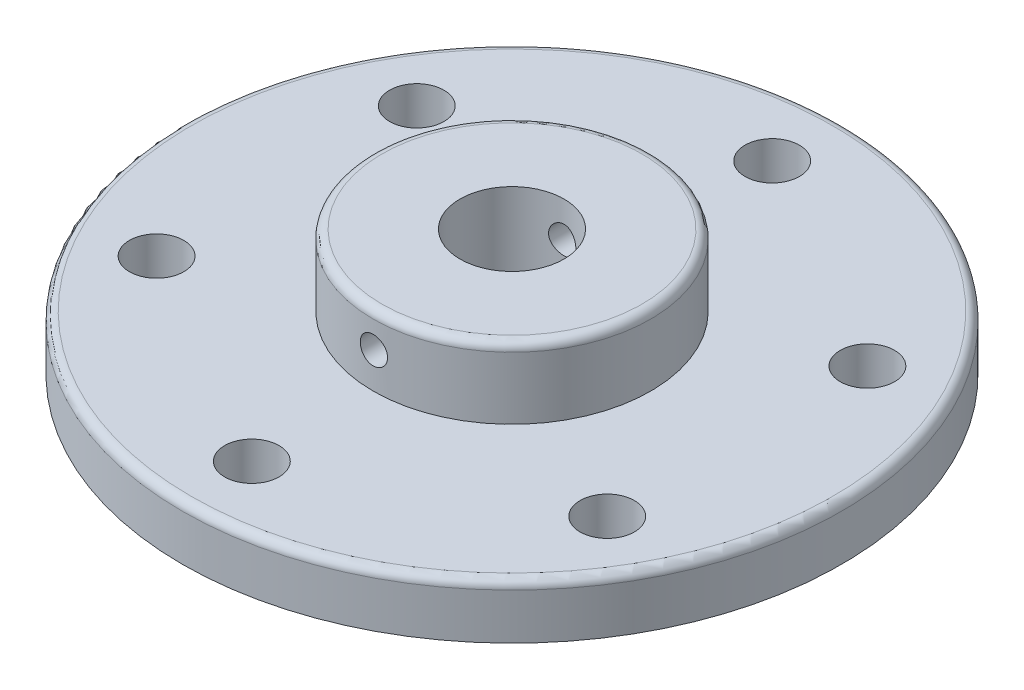
ISO-10303-21;
HEADER;
FILE_DESCRIPTION(('STEP AP214'),'2;1');
FILE_NAME('part.step','',(''),(''),'','','');
FILE_SCHEMA(('AUTOMOTIVE_DESIGN { 1 0 10303 214 1 1 1 1 }'));
ENDSEC;
DATA;
#1=APPLICATION_CONTEXT('core data for automotive mechanical design processes');
#2=APPLICATION_PROTOCOL_DEFINITION('international standard','automotive_design',2000,#1);
#3=PRODUCT_CONTEXT('',#1,'mechanical');
#4=PRODUCT('Part','Part','',(#3));
#5=PRODUCT_RELATED_PRODUCT_CATEGORY('part','',(#4));
#6=PRODUCT_DEFINITION_FORMATION('','',#4);
#7=PRODUCT_DEFINITION_CONTEXT('part definition',#1,'design');
#8=PRODUCT_DEFINITION('design','',#6,#7);
#9=PRODUCT_DEFINITION_SHAPE('','',#8);
#10=(LENGTH_UNIT() NAMED_UNIT(*) SI_UNIT(.MILLI.,.METRE.));
#11=(NAMED_UNIT(*) PLANE_ANGLE_UNIT() SI_UNIT($,.RADIAN.));
#12=(NAMED_UNIT(*) SI_UNIT($,.STERADIAN.) SOLID_ANGLE_UNIT());
#13=UNCERTAINTY_MEASURE_WITH_UNIT(LENGTH_MEASURE(1.E-05),#10,'distance_accuracy_value','');
#14=(GEOMETRIC_REPRESENTATION_CONTEXT(3) GLOBAL_UNCERTAINTY_ASSIGNED_CONTEXT((#13)) GLOBAL_UNIT_ASSIGNED_CONTEXT((#10,
#11,#12)) REPRESENTATION_CONTEXT('',''));
#15=CARTESIAN_POINT('',(0.,0.,0.));
#16=DIRECTION('',(0.,0.,1.));
#17=DIRECTION('',(1.,0.,0.));
#18=AXIS2_PLACEMENT_3D('',#15,#16,#17);
#19=CARTESIAN_POINT('',(0.,-5.,0.));
#20=DIRECTION('',(0.,1.,0.));
#21=DIRECTION('',(0.,0.,1.));
#22=AXIS2_PLACEMENT_3D('',#19,#20,#21);
#23=CYLINDRICAL_SURFACE('',#22,30.1625);
#24=CARTESIAN_POINT('',(0.,-0.79375,0.));
#25=DIRECTION('',(0.,1.,0.));
#26=DIRECTION('',(0.,0.,1.));
#27=AXIS2_PLACEMENT_3D('',#24,#25,#26);
#28=CIRCLE('',#27,30.1625);
#29=CARTESIAN_POINT('',(0.,-0.79375,30.1625));
#30=VERTEX_POINT('',#29);
#31=EDGE_CURVE('E10',#30,#30,#28,.F.);
#32=ORIENTED_EDGE('',*,*,#31,.T.);
#33=EDGE_LOOP('',(#32));
#34=FACE_BOUND('',#33,.T.);
#35=CARTESIAN_POINT('',(0.,-5.,0.));
#36=DIRECTION('',(0.,1.,0.));
#37=DIRECTION('',(0.,0.,1.));
#38=AXIS2_PLACEMENT_3D('',#35,#36,#37);
#39=CIRCLE('',#38,30.1625);
#40=CARTESIAN_POINT('',(0.,-5.,30.1625));
#41=VERTEX_POINT('',#40);
#42=EDGE_CURVE('E136',#41,#41,#39,.T.);
#43=ORIENTED_EDGE('',*,*,#42,.T.);
#44=EDGE_LOOP('',(#43));
#45=FACE_BOUND('',#44,.T.);
#46=ADVANCED_FACE('F38',(#34,#45),#23,.T.);
#47=CARTESIAN_POINT('',(0.,-5.,0.));
#48=DIRECTION('',(0.,1.,0.));
#49=DIRECTION('',(0.,0.,1.));
#50=AXIS2_PLACEMENT_3D('',#47,#48,#49);
#51=CYLINDRICAL_SURFACE('',#50,4.7625);
#52=CARTESIAN_POINT('',(0.,2.,4.7625));
#53=CARTESIAN_POINT('',(0.0689488269895443,2.00000171735201,4.76249892350248));
#54=CARTESIAN_POINT('',(0.137916249732853,2.00572387211581,4.76098791352569));
#55=CARTESIAN_POINT('',(0.273866948453047,2.02842240107246,4.75510685303733));
#56=CARTESIAN_POINT('',(0.340849208276611,2.04540443840435,4.75073536386706));
#57=CARTESIAN_POINT('',(0.470847324819608,2.09003455682169,4.73961624911541));
#58=CARTESIAN_POINT('',(0.533868088670452,2.1176691271607,4.73287163434153));
#59=CARTESIAN_POINT('',(0.654380149036169,2.18277043361157,4.71772047020067));
#60=CARTESIAN_POINT('',(0.711871122906726,2.22023774295513,4.70931382394719));
#61=CARTESIAN_POINT('',(0.820986470277109,2.30483200429416,4.69153581720155));
#62=CARTESIAN_POINT('',(0.872468553444093,2.35213911742376,4.68214837483676));
#63=CARTESIAN_POINT('',(0.96686688478941,2.45468482974981,4.66357097403559));
#64=CARTESIAN_POINT('',(1.00978206633533,2.509924415118,4.65438104031722));
#65=CARTESIAN_POINT('',(1.08651582428672,2.6278948176093,4.63707529018651));
#66=CARTESIAN_POINT('',(1.12017187342694,2.69073460486448,4.6289797969026));
#67=CARTESIAN_POINT('',(1.17638558308836,2.82142742777947,4.61501548950117));
#68=CARTESIAN_POINT('',(1.1989452192048,2.88927956856841,4.60914627906091));
#69=CARTESIAN_POINT('',(1.23183379886142,3.02649802227186,4.60046491688714));
#70=CARTESIAN_POINT('',(1.24242017860249,3.09579847100102,4.59758852991801));
#71=CARTESIAN_POINT('',(1.25186415000504,3.23524683470881,4.59502647971797));
#72=CARTESIAN_POINT('',(1.25072385935279,3.30539459438866,4.59534024038719));
#73=CARTESIAN_POINT('',(1.23695149883691,3.44254642657536,4.59906547949983));
#74=CARTESIAN_POINT('',(1.22462970188497,3.50958428719493,4.60239331631598));
#75=CARTESIAN_POINT('',(1.1893405287158,3.64060624329908,4.61163798030708));
#76=CARTESIAN_POINT('',(1.16637232540632,3.7045901010999,4.61755500862773));
#77=CARTESIAN_POINT('',(1.11018652844068,3.82850251570776,4.63138572997379));
#78=CARTESIAN_POINT('',(1.07685917787071,3.88837883830269,4.63932063065522));
#79=CARTESIAN_POINT('',(1.00097774509561,4.00179874829137,4.65628148655067));
#80=CARTESIAN_POINT('',(0.958421898098481,4.05534112139473,4.66530765030377));
#81=CARTESIAN_POINT('',(0.863699684388387,4.15634737338864,4.68378320724794));
#82=CARTESIAN_POINT('',(0.811272432129532,4.20356613335335,4.69323696794645));
#83=CARTESIAN_POINT('',(0.69912855558021,4.28859070192067,4.71124674232189));
#84=CARTESIAN_POINT('',(0.639411661618622,4.32639616213275,4.71980272276477));
#85=CARTESIAN_POINT('',(0.514011757722163,4.39162423624815,4.73510285261534));
#86=CARTESIAN_POINT('',(0.448305300721089,4.41900366482509,4.741839433184));
#87=CARTESIAN_POINT('',(0.31300524095278,4.46225782022922,4.75268695115514));
#88=CARTESIAN_POINT('',(0.243412463556183,4.47813497995712,4.75679844378086));
#89=CARTESIAN_POINT('',(0.104408120703845,4.49755175001476,4.76184902928973));
#90=CARTESIAN_POINT('',(0.0350461696468035,4.50142475686744,4.76287382691041));
#91=CARTESIAN_POINT('',(-0.103335803501143,4.49764237430326,4.76188136816725));
#92=CARTESIAN_POINT('',(-0.172355859057596,4.48998813650211,4.75986441568581));
#93=CARTESIAN_POINT('',(-0.306912963279038,4.46364236805612,4.7530703319408));
#94=CARTESIAN_POINT('',(-0.37248876628675,4.44513574579216,4.74833947030658));
#95=CARTESIAN_POINT('',(-0.499599496842098,4.39782436091347,4.73665325835686));
#96=CARTESIAN_POINT('',(-0.561133992851572,4.36901850063674,4.72969767094507));
#97=CARTESIAN_POINT('',(-0.679718836805753,4.30130081725949,4.71413156698966));
#98=CARTESIAN_POINT('',(-0.73666090763665,4.2622062398836,4.70549194189251));
#99=CARTESIAN_POINT('',(-0.843293871093428,4.17525160425879,4.68755697205323));
#100=CARTESIAN_POINT('',(-0.89298337464544,4.127389870797,4.67826150220249));
#101=CARTESIAN_POINT('',(-0.985097687855372,4.02270557314037,4.65974890421523));
#102=CARTESIAN_POINT('',(-1.02728759830267,3.96567434196143,4.65054081563012));
#103=CARTESIAN_POINT('',(-1.10150190977155,3.84514800694654,4.63352511650848));
#104=CARTESIAN_POINT('',(-1.13352674443343,3.78165317899911,4.62571744623653));
#105=CARTESIAN_POINT('',(-1.18626077762451,3.65032645845984,4.61247560327066));
#106=CARTESIAN_POINT('',(-1.20703611666268,3.58252259423882,4.6070275958912));
#107=CARTESIAN_POINT('',(-1.23684299798427,3.44421726027496,4.59911599923542));
#108=CARTESIAN_POINT('',(-1.24587742774386,3.37371645819029,4.59665167618307));
#109=CARTESIAN_POINT('',(-1.25178379299123,3.23441956279485,4.59504639964924));
#110=CARTESIAN_POINT('',(-1.24903271196827,3.16564039782814,4.59580243207657));
#111=CARTESIAN_POINT('',(-1.23231761019831,3.02956363976079,4.60031226908765));
#112=CARTESIAN_POINT('',(-1.21835386109659,2.96226601080809,4.60406600104719));
#113=CARTESIAN_POINT('',(-1.17982517655743,2.83152047600659,4.61408795675081));
#114=CARTESIAN_POINT('',(-1.15533776233217,2.76804821598219,4.62033777009164));
#115=CARTESIAN_POINT('',(-1.09651728065576,2.6460655717931,4.63464866254929));
#116=CARTESIAN_POINT('',(-1.06218271349251,2.58755594519288,4.64271001752169));
#117=CARTESIAN_POINT('',(-0.983489925232753,2.47535422691613,4.66002342411812));
#118=CARTESIAN_POINT('',(-0.938873327565306,2.42184755691273,4.66930291627762));
#119=CARTESIAN_POINT('',(-0.841377495724145,2.32295814995551,4.68785113845597));
#120=CARTESIAN_POINT('',(-0.78849626845352,2.27757737832148,4.69711986533406));
#121=CARTESIAN_POINT('',(-0.674662319319914,2.19531409863569,4.71482962144214));
#122=CARTESIAN_POINT('',(-0.613566194670514,2.15862515796498,4.72324975484127));
#123=CARTESIAN_POINT('',(-0.485855224781156,2.09609700837243,4.73808723116027));
#124=CARTESIAN_POINT('',(-0.41924406347045,2.07025062575191,4.74450589757513));
#125=CARTESIAN_POINT('',(-0.294038318804134,2.0336332201612,4.75375633848032));
#126=CARTESIAN_POINT('',(-0.235998618132914,2.02104952393142,4.75701167518968));
#127=CARTESIAN_POINT('',(-0.118643789063094,2.00423256019399,4.7613838704496));
#128=CARTESIAN_POINT('',(-0.059328778848326,1.99999852226061,4.76250092629978));
#129=CARTESIAN_POINT('',(0.,2.,4.7625));
#130=B_SPLINE_CURVE_WITH_KNOTS('',3,(#52,#53,#54,#55,#56,#57,#58,#59,#60,#61,#62,#63,#64,#65,
#66,#67,#68,#69,#70,#71,#72,#73,#74,#75,#76,#77,#78,#79,#80,#81,#82,#83,#84,#85,#86,#87,#88,#89,
#90,#91,#92,#93,#94,#95,#96,#97,#98,#99,#100,#101,#102,#103,#104,#105,#106,#107,#108,#109,#110,
#111,#112,#113,#114,#115,#116,#117,#118,#119,#120,#121,#122,#123,#124,#125,#126,#127,#128,#129),
.UNSPECIFIED.,.T.,.F.,(4,2,2,2,2,2,2,2,2,2,2,2,2,2,2,2,2,2,2,2,2,2,2,2,2,2,2,2,2,2,2,2,2,2,2,2,
2,2,4),(0.,0.206628947540086,0.413361897673242,0.619833503863802,0.82631714966735,
1.03697999238148,1.24766904759022,1.46184949115505,1.6759917884144,1.88543667630244,
2.09484374179415,2.29861197653731,2.50239604417056,2.70841740289268,2.91447819447152,
3.12704121112376,3.33961209366173,3.55305412213804,3.76645099126344,3.97386542536042,
4.18125913933899,4.38521782999526,4.58919826444181,4.79708014026652,5.00500177931068,
5.21859009069134,5.43216928920839,5.6444787416811,5.85673597038204,6.06225528548328,
6.26776962169216,6.47179533639976,6.67585214054694,6.88573951059617,7.0956775753812,
7.30992507905382,7.52403060697187,7.70184616919218,7.87964532354366),.UNSPECIFIED.);
#131=CARTESIAN_POINT('',(0.,2.,4.7625));
#132=VERTEX_POINT('',#131);
#133=EDGE_CURVE('E102',#132,#132,#130,.T.);
#134=ORIENTED_EDGE('',*,*,#133,.T.);
#135=EDGE_LOOP('',(#134));
#136=FACE_BOUND('',#135,.T.);
#137=CARTESIAN_POINT('',(0.,2.,-4.7625));
#138=CARTESIAN_POINT('',(-0.0689488269895444,2.00000171735201,-4.76249892350248));
#139=CARTESIAN_POINT('',(-0.137916249732853,2.00572387211582,-4.76098791352569));
#140=CARTESIAN_POINT('',(-0.273866948453047,2.02842240107246,-4.75510685303733));
#141=CARTESIAN_POINT('',(-0.340849208276612,2.04540443840435,-4.75073536386706));
#142=CARTESIAN_POINT('',(-0.470847324819608,2.09003455682169,-4.73961624911541));
#143=CARTESIAN_POINT('',(-0.533868088670452,2.1176691271607,-4.73287163434153));
#144=CARTESIAN_POINT('',(-0.654380149036169,2.18277043361157,-4.71772047020067));
#145=CARTESIAN_POINT('',(-0.711871122906726,2.22023774295513,-4.70931382394719));
#146=CARTESIAN_POINT('',(-0.820986470277109,2.30483200429416,-4.69153581720155));
#147=CARTESIAN_POINT('',(-0.872468553444092,2.35213911742376,-4.68214837483676));
#148=CARTESIAN_POINT('',(-0.96686688478941,2.45468482974981,-4.66357097403559));
#149=CARTESIAN_POINT('',(-1.00978206633533,2.509924415118,-4.65438104031722));
#150=CARTESIAN_POINT('',(-1.08651582428672,2.6278948176093,-4.63707529018651));
#151=CARTESIAN_POINT('',(-1.12017187342694,2.69073460486448,-4.6289797969026));
#152=CARTESIAN_POINT('',(-1.17638558308836,2.82142742777947,-4.61501548950117));
#153=CARTESIAN_POINT('',(-1.1989452192048,2.88927956856841,-4.60914627906091));
#154=CARTESIAN_POINT('',(-1.23183379886142,3.02649802227186,-4.60046491688714));
#155=CARTESIAN_POINT('',(-1.24242017860249,3.09579847100102,-4.59758852991801));
#156=CARTESIAN_POINT('',(-1.25186415000504,3.23524683470881,-4.59502647971797));
#157=CARTESIAN_POINT('',(-1.25072385935279,3.30539459438866,-4.59534024038719));
#158=CARTESIAN_POINT('',(-1.23695149883691,3.44254642657536,-4.59906547949983));
#159=CARTESIAN_POINT('',(-1.22462970188497,3.50958428719493,-4.60239331631598));
#160=CARTESIAN_POINT('',(-1.1893405287158,3.64060624329908,-4.61163798030708));
#161=CARTESIAN_POINT('',(-1.16637232540632,3.7045901010999,-4.61755500862773));
#162=CARTESIAN_POINT('',(-1.11018652844068,3.82850251570776,-4.63138572997379));
#163=CARTESIAN_POINT('',(-1.07685917787071,3.88837883830269,-4.63932063065522));
#164=CARTESIAN_POINT('',(-1.00097774509561,4.00179874829137,-4.65628148655067));
#165=CARTESIAN_POINT('',(-0.95842189809848,4.05534112139473,-4.66530765030377));
#166=CARTESIAN_POINT('',(-0.863699684388387,4.15634737338864,-4.68378320724794));
#167=CARTESIAN_POINT('',(-0.811272432129532,4.20356613335335,-4.69323696794645));
#168=CARTESIAN_POINT('',(-0.699128555580209,4.28859070192068,-4.71124674232189));
#169=CARTESIAN_POINT('',(-0.639411661618621,4.32639616213276,-4.71980272276477));
#170=CARTESIAN_POINT('',(-0.514011757722162,4.39162423624815,-4.73510285261534));
#171=CARTESIAN_POINT('',(-0.448305300721088,4.41900366482509,-4.741839433184));
#172=CARTESIAN_POINT('',(-0.31300524095278,4.46225782022922,-4.75268695115514));
#173=CARTESIAN_POINT('',(-0.243412463556183,4.47813497995712,-4.75679844378086));
#174=CARTESIAN_POINT('',(-0.104408120703845,4.49755175001476,-4.76184902928973));
#175=CARTESIAN_POINT('',(-0.0350461696468035,4.50142475686745,-4.76287382691041));
#176=CARTESIAN_POINT('',(0.103335803501143,4.49764237430327,-4.76188136816725));
#177=CARTESIAN_POINT('',(0.172355859057596,4.48998813650211,-4.75986441568581));
#178=CARTESIAN_POINT('',(0.306912963279037,4.46364236805612,-4.7530703319408));
#179=CARTESIAN_POINT('',(0.37248876628675,4.44513574579216,-4.74833947030658));
#180=CARTESIAN_POINT('',(0.499599496842098,4.39782436091347,-4.73665325835686));
#181=CARTESIAN_POINT('',(0.561133992851572,4.36901850063674,-4.72969767094507));
#182=CARTESIAN_POINT('',(0.679718836805753,4.30130081725949,-4.71413156698966));
#183=CARTESIAN_POINT('',(0.736660907636649,4.2622062398836,-4.70549194189251));
#184=CARTESIAN_POINT('',(0.843293871093428,4.17525160425879,-4.68755697205323));
#185=CARTESIAN_POINT('',(0.892983374645439,4.127389870797,-4.67826150220249));
#186=CARTESIAN_POINT('',(0.985097687855372,4.02270557314037,-4.65974890421523));
#187=CARTESIAN_POINT('',(1.02728759830267,3.96567434196143,-4.65054081563012));
#188=CARTESIAN_POINT('',(1.10150190977155,3.84514800694654,-4.63352511650848));
#189=CARTESIAN_POINT('',(1.13352674443343,3.78165317899911,-4.62571744623653));
#190=CARTESIAN_POINT('',(1.18626077762451,3.65032645845984,-4.61247560327066));
#191=CARTESIAN_POINT('',(1.20703611666268,3.58252259423883,-4.6070275958912));
#192=CARTESIAN_POINT('',(1.23684299798427,3.44421726027496,-4.59911599923542));
#193=CARTESIAN_POINT('',(1.24587742774386,3.37371645819029,-4.59665167618307));
#194=CARTESIAN_POINT('',(1.25178379299123,3.23441956279485,-4.59504639964924));
#195=CARTESIAN_POINT('',(1.24903271196827,3.16564039782814,-4.59580243207657));
#196=CARTESIAN_POINT('',(1.23231761019831,3.02956363976079,-4.60031226908765));
#197=CARTESIAN_POINT('',(1.21835386109659,2.96226601080809,-4.60406600104719));
#198=CARTESIAN_POINT('',(1.17982517655743,2.83152047600659,-4.61408795675081));
#199=CARTESIAN_POINT('',(1.15533776233217,2.76804821598219,-4.62033777009164));
#200=CARTESIAN_POINT('',(1.09651728065576,2.6460655717931,-4.63464866254929));
#201=CARTESIAN_POINT('',(1.06218271349251,2.58755594519288,-4.64271001752169));
#202=CARTESIAN_POINT('',(0.983489925232753,2.47535422691613,-4.66002342411812));
#203=CARTESIAN_POINT('',(0.938873327565306,2.42184755691273,-4.66930291627762));
#204=CARTESIAN_POINT('',(0.841377495724145,2.32295814995552,-4.68785113845597));
#205=CARTESIAN_POINT('',(0.788496268453521,2.27757737832148,-4.69711986533406));
#206=CARTESIAN_POINT('',(0.674662319319914,2.19531409863569,-4.71482962144214));
#207=CARTESIAN_POINT('',(0.613566194670515,2.15862515796498,-4.72324975484127));
#208=CARTESIAN_POINT('',(0.485855224781156,2.09609700837244,-4.73808723116027));
#209=CARTESIAN_POINT('',(0.41924406347045,2.07025062575191,-4.74450589757513));
#210=CARTESIAN_POINT('',(0.294038318804134,2.0336332201612,-4.75375633848032));
#211=CARTESIAN_POINT('',(0.235998618132914,2.02104952393142,-4.75701167518968));
#212=CARTESIAN_POINT('',(0.118643789063094,2.00423256019399,-4.7613838704496));
#213=CARTESIAN_POINT('',(0.059328778848326,1.99999852226061,-4.76250092629978));
#214=CARTESIAN_POINT('',(0.,2.,-4.7625));
#215=B_SPLINE_CURVE_WITH_KNOTS('',3,(#137,#138,#139,#140,#141,#142,#143,#144,#145,#146,#147,
#148,#149,#150,#151,#152,#153,#154,#155,#156,#157,#158,#159,#160,#161,#162,#163,#164,#165,#166,
#167,#168,#169,#170,#171,#172,#173,#174,#175,#176,#177,#178,#179,#180,#181,#182,#183,#184,#185,
#186,#187,#188,#189,#190,#191,#192,#193,#194,#195,#196,#197,#198,#199,#200,#201,#202,#203,#204,
#205,#206,#207,#208,#209,#210,#211,#212,#213,#214),.UNSPECIFIED.,.T.,.F.,(4,2,2,2,2,2,2,2,2,2,2,
2,2,2,2,2,2,2,2,2,2,2,2,2,2,2,2,2,2,2,2,2,2,2,2,2,2,2,4),(0.,0.206628947540086,
0.413361897673242,0.619833503863802,0.82631714966735,1.03697999238148,1.24766904759022,
1.46184949115504,1.6759917884144,1.88543667630244,2.09484374179415,2.29861197653731,
2.50239604417056,2.70841740289268,2.91447819447152,3.12704121112376,3.33961209366173,
3.55305412213804,3.76645099126344,3.97386542536042,4.18125913933899,4.38521782999526,
4.58919826444181,4.79708014026652,5.00500177931068,5.21859009069134,5.43216928920839,
5.6444787416811,5.85673597038204,6.06225528548328,6.26776962169216,6.47179533639976,
6.67585214054694,6.88573951059617,7.0956775753812,7.30992507905383,7.52403060697187,
7.70184616919218,7.87964532354367),.UNSPECIFIED.);
#216=CARTESIAN_POINT('',(0.,2.,-4.7625));
#217=VERTEX_POINT('',#216);
#218=EDGE_CURVE('E95',#217,#217,#215,.T.);
#219=ORIENTED_EDGE('',*,*,#218,.T.);
#220=EDGE_LOOP('',(#219));
#221=FACE_BOUND('',#220,.T.);
#222=CARTESIAN_POINT('',(0.,-5.,0.));
#223=DIRECTION('',(0.,1.,0.));
#224=DIRECTION('',(0.,0.,1.));
#225=AXIS2_PLACEMENT_3D('',#222,#223,#224);
#226=CIRCLE('',#225,4.7625);
#227=CARTESIAN_POINT('',(0.,-5.,4.7625));
#228=VERTEX_POINT('',#227);
#229=EDGE_CURVE('E71',#228,#228,#226,.T.);
#230=ORIENTED_EDGE('',*,*,#229,.F.);
#231=EDGE_LOOP('',(#230));
#232=FACE_BOUND('',#231,.T.);
#233=CARTESIAN_POINT('',(0.,6.5,0.));
#234=DIRECTION('',(0.,1.,0.));
#235=DIRECTION('',(0.,0.,1.));
#236=AXIS2_PLACEMENT_3D('',#233,#234,#235);
#237=CIRCLE('',#236,4.7625);
#238=CARTESIAN_POINT('',(0.,6.5,4.7625));
#239=VERTEX_POINT('',#238);
#240=EDGE_CURVE('E133',#239,#239,#237,.T.);
#241=ORIENTED_EDGE('',*,*,#240,.T.);
#242=EDGE_LOOP('',(#241));
#243=FACE_BOUND('',#242,.T.);
#244=ADVANCED_FACE('F107',(#136,#221,#232,#243),#51,.F.);
#245=CARTESIAN_POINT('',(0.,-5.,0.));
#246=DIRECTION('',(0.,1.,0.));
#247=DIRECTION('',(0.,0.,1.));
#248=AXIS2_PLACEMENT_3D('',#245,#246,#247);
#249=PLANE('',#248);
#250=CARTESIAN_POINT('',(0.,-5.,-23.8125));
#251=DIRECTION('',(0.,1.,0.));
#252=DIRECTION('',(0.,0.,1.));
#253=AXIS2_PLACEMENT_3D('',#250,#251,#252);
#254=CIRCLE('',#253,2.4892);
#255=CARTESIAN_POINT('',(0.,-5.,-21.3233));
#256=VERTEX_POINT('',#255);
#257=EDGE_CURVE('E163',#256,#256,#254,.T.);
#258=ORIENTED_EDGE('',*,*,#257,.T.);
#259=EDGE_LOOP('',(#258));
#260=FACE_BOUND('',#259,.T.);
#261=CARTESIAN_POINT('',(20.6222299276169,-5.,-11.90625));
#262=DIRECTION('',(0.,1.,0.));
#263=DIRECTION('',(0.,0.,1.));
#264=AXIS2_PLACEMENT_3D('',#261,#262,#263);
#265=CIRCLE('',#264,2.4892);
#266=CARTESIAN_POINT('',(20.6222299276169,-5.,-9.41705000000001));
#267=VERTEX_POINT('',#266);
#268=EDGE_CURVE('E167',#267,#267,#265,.T.);
#269=ORIENTED_EDGE('',*,*,#268,.T.);
#270=EDGE_LOOP('',(#269));
#271=FACE_BOUND('',#270,.T.);
#272=CARTESIAN_POINT('',(20.6222299276169,-5.,11.90625));
#273=DIRECTION('',(0.,1.,0.));
#274=DIRECTION('',(0.,0.,1.));
#275=AXIS2_PLACEMENT_3D('',#272,#273,#274);
#276=CIRCLE('',#275,2.4892);
#277=CARTESIAN_POINT('',(20.6222299276169,-5.,14.39545));
#278=VERTEX_POINT('',#277);
#279=EDGE_CURVE('E171',#278,#278,#276,.T.);
#280=ORIENTED_EDGE('',*,*,#279,.T.);
#281=EDGE_LOOP('',(#280));
#282=FACE_BOUND('',#281,.T.);
#283=CARTESIAN_POINT('',(-20.622229927617,-5.,-11.90625));
#284=DIRECTION('',(0.,1.,0.));
#285=DIRECTION('',(0.,0.,1.));
#286=AXIS2_PLACEMENT_3D('',#283,#284,#285);
#287=CIRCLE('',#286,2.4892);
#288=CARTESIAN_POINT('',(-20.622229927617,-5.,-9.41704999999999));
#289=VERTEX_POINT('',#288);
#290=EDGE_CURVE('E175',#289,#289,#287,.T.);
#291=ORIENTED_EDGE('',*,*,#290,.T.);
#292=EDGE_LOOP('',(#291));
#293=FACE_BOUND('',#292,.T.);
#294=CARTESIAN_POINT('',(-20.6222299276169,-5.,11.90625));
#295=DIRECTION('',(0.,1.,0.));
#296=DIRECTION('',(0.,0.,1.));
#297=AXIS2_PLACEMENT_3D('',#294,#295,#296);
#298=CIRCLE('',#297,2.4892);
#299=CARTESIAN_POINT('',(-20.6222299276169,-5.,14.39545));
#300=VERTEX_POINT('',#299);
#301=EDGE_CURVE('E179',#300,#300,#298,.T.);
#302=ORIENTED_EDGE('',*,*,#301,.T.);
#303=EDGE_LOOP('',(#302));
#304=FACE_BOUND('',#303,.T.);
#305=CARTESIAN_POINT('',(0.,-5.,23.8125));
#306=DIRECTION('',(0.,1.,0.));
#307=DIRECTION('',(0.,0.,1.));
#308=AXIS2_PLACEMENT_3D('',#305,#306,#307);
#309=CIRCLE('',#308,2.4892);
#310=CARTESIAN_POINT('',(0.,-5.,26.3017));
#311=VERTEX_POINT('',#310);
#312=EDGE_CURVE('E144',#311,#311,#309,.T.);
#313=ORIENTED_EDGE('',*,*,#312,.T.);
#314=EDGE_LOOP('',(#313));
#315=FACE_BOUND('',#314,.T.);
#316=ORIENTED_EDGE('',*,*,#42,.F.);
#317=EDGE_LOOP('',(#316));
#318=FACE_BOUND('',#317,.T.);
#319=ORIENTED_EDGE('',*,*,#229,.T.);
#320=EDGE_LOOP('',(#319));
#321=FACE_BOUND('',#320,.T.);
#322=ADVANCED_FACE('F112',(#260,#271,#282,#293,#304,#315,#318,#321),#249,.F.);
#323=CARTESIAN_POINT('',(0.,0.,0.));
#324=DIRECTION('',(0.,1.,0.));
#325=DIRECTION('',(0.,0.,1.));
#326=AXIS2_PLACEMENT_3D('',#323,#324,#325);
#327=PLANE('',#326);
#328=CARTESIAN_POINT('',(0.,0.,0.));
#329=DIRECTION('',(0.,1.,0.));
#330=DIRECTION('',(0.,0.,1.));
#331=AXIS2_PLACEMENT_3D('',#328,#329,#330);
#332=CIRCLE('',#331,29.36875);
#333=CARTESIAN_POINT('',(0.,0.,29.36875));
#334=VERTEX_POINT('',#333);
#335=EDGE_CURVE('E46',#334,#334,#332,.T.);
#336=ORIENTED_EDGE('',*,*,#335,.T.);
#337=EDGE_LOOP('',(#336));
#338=FACE_BOUND('',#337,.T.);
#339=CARTESIAN_POINT('',(0.,0.,-23.8125));
#340=DIRECTION('',(0.,1.,0.));
#341=DIRECTION('',(0.,0.,1.));
#342=AXIS2_PLACEMENT_3D('',#339,#340,#341);
#343=CIRCLE('',#342,2.4892);
#344=CARTESIAN_POINT('',(0.,0.,-21.3233));
#345=VERTEX_POINT('',#344);
#346=EDGE_CURVE('E218',#345,#345,#343,.T.);
#347=ORIENTED_EDGE('',*,*,#346,.F.);
#348=EDGE_LOOP('',(#347));
#349=FACE_BOUND('',#348,.T.);
#350=CARTESIAN_POINT('',(20.6222299276169,0.,-11.90625));
#351=DIRECTION('',(0.,1.,0.));
#352=DIRECTION('',(0.,0.,1.));
#353=AXIS2_PLACEMENT_3D('',#350,#351,#352);
#354=CIRCLE('',#353,2.4892);
#355=CARTESIAN_POINT('',(20.6222299276169,0.,-9.41705000000001));
#356=VERTEX_POINT('',#355);
#357=EDGE_CURVE('E213',#356,#356,#354,.T.);
#358=ORIENTED_EDGE('',*,*,#357,.F.);
#359=EDGE_LOOP('',(#358));
#360=FACE_BOUND('',#359,.T.);
#361=CARTESIAN_POINT('',(20.6222299276169,0.,11.90625));
#362=DIRECTION('',(0.,1.,0.));
#363=DIRECTION('',(0.,0.,1.));
#364=AXIS2_PLACEMENT_3D('',#361,#362,#363);
#365=CIRCLE('',#364,2.4892);
#366=CARTESIAN_POINT('',(20.6222299276169,0.,14.39545));
#367=VERTEX_POINT('',#366);
#368=EDGE_CURVE('E207',#367,#367,#365,.T.);
#369=ORIENTED_EDGE('',*,*,#368,.F.);
#370=EDGE_LOOP('',(#369));
#371=FACE_BOUND('',#370,.T.);
#372=CARTESIAN_POINT('',(-20.622229927617,0.,-11.90625));
#373=DIRECTION('',(0.,1.,0.));
#374=DIRECTION('',(0.,0.,1.));
#375=AXIS2_PLACEMENT_3D('',#372,#373,#374);
#376=CIRCLE('',#375,2.4892);
#377=CARTESIAN_POINT('',(-20.622229927617,0.,-9.41704999999999));
#378=VERTEX_POINT('',#377);
#379=EDGE_CURVE('E201',#378,#378,#376,.T.);
#380=ORIENTED_EDGE('',*,*,#379,.F.);
#381=EDGE_LOOP('',(#380));
#382=FACE_BOUND('',#381,.T.);
#383=CARTESIAN_POINT('',(-20.6222299276169,0.,11.90625));
#384=DIRECTION('',(0.,1.,0.));
#385=DIRECTION('',(0.,0.,1.));
#386=AXIS2_PLACEMENT_3D('',#383,#384,#385);
#387=CIRCLE('',#386,2.4892);
#388=CARTESIAN_POINT('',(-20.6222299276169,0.,14.39545));
#389=VERTEX_POINT('',#388);
#390=EDGE_CURVE('E193',#389,#389,#387,.T.);
#391=ORIENTED_EDGE('',*,*,#390,.F.);
#392=EDGE_LOOP('',(#391));
#393=FACE_BOUND('',#392,.T.);
#394=CARTESIAN_POINT('',(0.,0.,23.8125));
#395=DIRECTION('',(0.,1.,0.));
#396=DIRECTION('',(0.,0.,1.));
#397=AXIS2_PLACEMENT_3D('',#394,#395,#396);
#398=CIRCLE('',#397,2.4892);
#399=CARTESIAN_POINT('',(0.,0.,26.3017));
#400=VERTEX_POINT('',#399);
#401=EDGE_CURVE('E187',#400,#400,#398,.T.);
#402=ORIENTED_EDGE('',*,*,#401,.F.);
#403=EDGE_LOOP('',(#402));
#404=FACE_BOUND('',#403,.T.);
#405=CARTESIAN_POINT('',(0.,0.,0.));
#406=DIRECTION('',(0.,1.,0.));
#407=DIRECTION('',(0.,0.,1.));
#408=AXIS2_PLACEMENT_3D('',#405,#406,#407);
#409=CIRCLE('',#408,12.7);
#410=CARTESIAN_POINT('',(0.,0.,12.7));
#411=VERTEX_POINT('',#410);
#412=EDGE_CURVE('E137',#411,#411,#409,.T.);
#413=ORIENTED_EDGE('',*,*,#412,.F.);
#414=EDGE_LOOP('',(#413));
#415=FACE_BOUND('',#414,.T.);
#416=ADVANCED_FACE('F114',(#338,#349,#360,#371,#382,#393,#404,#415),#327,.T.);
#417=CARTESIAN_POINT('',(0.,6.5,0.));
#418=DIRECTION('',(0.,-1.,0.));
#419=DIRECTION('',(0.,0.,-1.));
#420=AXIS2_PLACEMENT_3D('',#417,#418,#419);
#421=CYLINDRICAL_SURFACE('',#420,12.7);
#422=CARTESIAN_POINT('',(0.,5.70625,0.));
#423=DIRECTION('',(0.,1.,0.));
#424=DIRECTION('',(0.,0.,1.));
#425=AXIS2_PLACEMENT_3D('',#422,#423,#424);
#426=CIRCLE('',#425,12.7);
#427=CARTESIAN_POINT('',(0.,5.70625,12.7));
#428=VERTEX_POINT('',#427);
#429=EDGE_CURVE('E51',#428,#428,#426,.F.);
#430=ORIENTED_EDGE('',*,*,#429,.T.);
#431=EDGE_LOOP('',(#430));
#432=FACE_BOUND('',#431,.T.);
#433=CARTESIAN_POINT('',(0.,2.,12.7));
#434=CARTESIAN_POINT('',(-0.0700312826447143,2.00000303546489,12.6999992053767));
#435=CARTESIAN_POINT('',(-0.14010900678754,2.00590506924033,12.6994145852931));
#436=CARTESIAN_POINT('',(-0.27832202784406,2.02936056646902,12.6971386355552));
#437=CARTESIAN_POINT('',(-0.346455091701956,2.04692690368872,12.6954460831171));
#438=CARTESIAN_POINT('',(-0.478757289636587,2.0931950211263,12.6911453487048));
#439=CARTESIAN_POINT('',(-0.542928775594424,2.12189011935505,12.6885377162568));
#440=CARTESIAN_POINT('',(-0.665530357530224,2.18958834239711,12.6826984877893));
#441=CARTESIAN_POINT('',(-0.723961600791191,2.22858940161936,12.6794670168387));
#442=CARTESIAN_POINT('',(-0.833642201405573,2.31593867561093,12.6727295439492));
#443=CARTESIAN_POINT('',(-0.884868708381634,2.36431552194277,12.6692227211751));
#444=CARTESIAN_POINT('',(-0.978489341246064,2.46898211143332,12.6623365830734));
#445=CARTESIAN_POINT('',(-1.02088306075885,2.52527221846293,12.6589572736182));
#446=CARTESIAN_POINT('',(-1.09571529914481,2.64431002660821,12.6527003451726));
#447=CARTESIAN_POINT('',(-1.12813319805397,2.70707074991373,12.6498237705616));
#448=CARTESIAN_POINT('',(-1.18196189962952,2.837177901841,12.6449081047838));
#449=CARTESIAN_POINT('',(-1.20337296627196,2.90452422044288,12.6428689935324));
#450=CARTESIAN_POINT('',(-1.23451262073334,3.0416581946059,12.6398664963312));
#451=CARTESIAN_POINT('',(-1.24427904323655,3.11143718133028,12.6388996272722));
#452=CARTESIAN_POINT('',(-1.25196912321573,3.25165010379155,12.6381402528445));
#453=CARTESIAN_POINT('',(-1.24989308284717,3.32208402277234,12.6383477175131));
#454=CARTESIAN_POINT('',(-1.23398836132346,3.46134679843134,12.6399103906683));
#455=CARTESIAN_POINT('',(-1.22020097097041,3.5301804223952,12.6412615667039));
#456=CARTESIAN_POINT('',(-1.18132916034646,3.66455192058459,12.6449531171045));
#457=CARTESIAN_POINT('',(-1.15624459176253,3.73008975152931,12.647293504456));
#458=CARTESIAN_POINT('',(-1.09544483971353,3.8561398371098,12.6527044143333));
#459=CARTESIAN_POINT('',(-1.05971131587941,3.91664318915494,12.6557761946647));
#460=CARTESIAN_POINT('',(-0.978641180257095,4.03080943580754,12.6623027037322));
#461=CARTESIAN_POINT('',(-0.933304296235701,4.08447213642915,12.6657574433229));
#462=CARTESIAN_POINT('',(-0.83408366976097,4.18367374710584,12.6726785733742));
#463=CARTESIAN_POINT('',(-0.780164263845076,4.22917699540741,12.6761449506051));
#464=CARTESIAN_POINT('',(-0.665433065104137,4.31049169399659,12.6826848403127));
#465=CARTESIAN_POINT('',(-0.604621264913217,4.34630313392646,12.6857583523697));
#466=CARTESIAN_POINT('',(-0.477806949734053,4.4072161493743,12.6911671737587));
#467=CARTESIAN_POINT('',(-0.41180357134731,4.43231593898526,12.6935023599762));
#468=CARTESIAN_POINT('',(-0.276491240194605,4.47106714583987,12.6971701449661));
#469=CARTESIAN_POINT('',(-0.20718238324472,4.48471889471556,12.6985027727811));
#470=CARTESIAN_POINT('',(-0.067535380014572,4.50014130971684,12.7000115586395));
#471=CARTESIAN_POINT('',(0.00279728138426567,4.5019611913186,12.7001925071073));
#472=CARTESIAN_POINT('',(0.142766620743804,4.49379744092128,12.6993903861296));
#473=CARTESIAN_POINT('',(0.212403307796412,4.48381396331995,12.6984073319102));
#474=CARTESIAN_POINT('',(0.348862094124246,4.45236771450181,12.6953907525744));
#475=CARTESIAN_POINT('',(0.415689548778697,4.43092796338468,12.6933593343073));
#476=CARTESIAN_POINT('',(0.544799292661249,4.37720140592747,12.6884739561919));
#477=CARTESIAN_POINT('',(0.607081482971617,4.34491436360548,12.6856199784491));
#478=CARTESIAN_POINT('',(0.725555402313411,4.27028751417399,12.6793968558126));
#479=CARTESIAN_POINT('',(0.78172665824703,4.22791534442074,12.6760260651466));
#480=CARTESIAN_POINT('',(0.886177033231954,4.13436746867763,12.6691529099366));
#481=CARTESIAN_POINT('',(0.934455960429516,4.08319154874042,12.6656505421968));
#482=CARTESIAN_POINT('',(1.02192188780566,3.97327424693378,12.6588945826013));
#483=CARTESIAN_POINT('',(1.06107660655671,3.91450711355364,12.6556419005479));
#484=CARTESIAN_POINT('',(1.12896079934357,3.79120270259733,12.6497673268535));
#485=CARTESIAN_POINT('',(1.1576904120812,3.72666550180381,12.6471454268203));
#486=CARTESIAN_POINT('',(1.20385472580367,3.59376400563288,12.6428348924729));
#487=CARTESIAN_POINT('',(1.22130869076844,3.52540645548039,12.6411446671599));
#488=CARTESIAN_POINT('',(1.24448878134745,3.38671346216954,12.6388838699205));
#489=CARTESIAN_POINT('',(1.25021523187232,3.31637807386188,12.638313266975));
#490=CARTESIAN_POINT('',(1.2497733093753,3.17604681895444,12.6383569507631));
#491=CARTESIAN_POINT('',(1.24365564734898,3.10605078555567,12.6389661859801));
#492=CARTESIAN_POINT('',(1.21980542436043,2.96808591692655,12.6412901330464));
#493=CARTESIAN_POINT('',(1.20207284979864,2.90011708406989,12.6430048461901));
#494=CARTESIAN_POINT('',(1.15551004195296,2.76813601419488,12.6473451495994));
#495=CARTESIAN_POINT('',(1.12668123967943,2.70412326821993,12.6499706224057));
#496=CARTESIAN_POINT('',(1.05874958964909,2.58183715655238,12.6558368552843));
#497=CARTESIAN_POINT('',(1.01964680995168,2.52356375284335,12.6590776112807));
#498=CARTESIAN_POINT('',(0.932086701457344,2.41415061890366,12.6658258690576));
#499=CARTESIAN_POINT('',(0.883591601308588,2.36304117952309,12.669334412013));
#500=CARTESIAN_POINT('',(0.778697716558492,2.2696628547399,12.6762134065084));
#501=CARTESIAN_POINT('',(0.72229703966484,2.22739609199076,12.6795838247362));
#502=CARTESIAN_POINT('',(0.603042575710225,2.15282209313431,12.6858153424876));
#503=CARTESIAN_POINT('',(0.540173319004092,2.12053950839736,12.6886751741136));
#504=CARTESIAN_POINT('',(0.409918728568402,2.0670320885035,12.6935494159781));
#505=CARTESIAN_POINT('',(0.342538594616495,2.04579476079757,12.6955647808325));
#506=CARTESIAN_POINT('',(0.228979465526957,2.02028784430099,12.6980154922455));
#507=CARTESIAN_POINT('',(0.183526855955049,2.01269026869299,12.6987562208227));
#508=CARTESIAN_POINT('',(0.0920561862478506,2.00254535880599,12.6997487349209));
#509=CARTESIAN_POINT('',(0.0460381283551262,1.99999800450432,12.7000005223804));
#510=CARTESIAN_POINT('',(0.,2.,12.7));
#511=B_SPLINE_CURVE_WITH_KNOTS('',3,(#433,#434,#435,#436,#437,#438,#439,#440,#441,#442,#443,
#444,#445,#446,#447,#448,#449,#450,#451,#452,#453,#454,#455,#456,#457,#458,#459,#460,#461,#462,
#463,#464,#465,#466,#467,#468,#469,#470,#471,#472,#473,#474,#475,#476,#477,#478,#479,#480,#481,
#482,#483,#484,#485,#486,#487,#488,#489,#490,#491,#492,#493,#494,#495,#496,#497,#498,#499,#500,
#501,#502,#503,#504,#505,#506,#507,#508,#509,#510),.UNSPECIFIED.,.T.,.F.,(4,2,2,2,2,2,2,2,2,2,2,
2,2,2,2,2,2,2,2,2,2,2,2,2,2,2,2,2,2,2,2,2,2,2,2,2,2,2,4),(0.,0.209925736404035,
0.420083551553888,0.630115377513743,0.840105139347872,1.05074656548352,1.26139768059231,
1.47248133014627,1.6835599170603,1.89395080193954,2.10433631880758,2.31398314193359,
2.52363271745131,2.73364547350685,2.9436641837385,3.15457954516842,3.3654951320049,
3.57644587015762,3.78739049718267,3.99745712088703,4.20752099677559,4.41716435140817,
4.6268122671099,4.83714222417455,5.0474772933667,5.25854559674416,5.4696110918405,
5.68031502987038,5.8910131302718,6.10081111385637,6.31060934308738,6.52038052502719,
6.73015031738431,6.94078190789727,7.15146400191708,7.36266220124829,7.57362100612735,
7.71162542287029,7.84962929246446),.UNSPECIFIED.);
#512=CARTESIAN_POINT('',(0.,2.,12.7));
#513=VERTEX_POINT('',#512);
#514=EDGE_CURVE('E62',#513,#513,#511,.T.);
#515=ORIENTED_EDGE('',*,*,#514,.T.);
#516=EDGE_LOOP('',(#515));
#517=FACE_BOUND('',#516,.T.);
#518=CARTESIAN_POINT('',(0.,4.49999999999999,-12.7));
#519=CARTESIAN_POINT('',(-0.0700312826447142,4.49999696453511,-12.6999992053767));
#520=CARTESIAN_POINT('',(-0.14010900678754,4.49409493075967,-12.6994145852931));
#521=CARTESIAN_POINT('',(-0.27832202784406,4.47063943353098,-12.6971386355552));
#522=CARTESIAN_POINT('',(-0.346455091701956,4.45307309631127,-12.6954460831171));
#523=CARTESIAN_POINT('',(-0.478757289636587,4.4068049788737,-12.6911453487048));
#524=CARTESIAN_POINT('',(-0.542928775594424,4.37810988064495,-12.6885377162568));
#525=CARTESIAN_POINT('',(-0.665530357530224,4.31041165760288,-12.6826984877893));
#526=CARTESIAN_POINT('',(-0.723961600791191,4.27141059838064,-12.6794670168387));
#527=CARTESIAN_POINT('',(-0.833642201405572,4.18406132438907,-12.6727295439492));
#528=CARTESIAN_POINT('',(-0.884868708381634,4.13568447805723,-12.6692227211751));
#529=CARTESIAN_POINT('',(-0.978489341246064,4.03101788856668,-12.6623365830734));
#530=CARTESIAN_POINT('',(-1.02088306075885,3.97472778153706,-12.6589572736182));
#531=CARTESIAN_POINT('',(-1.09571529914481,3.85568997339179,-12.6527003451726));
#532=CARTESIAN_POINT('',(-1.12813319805397,3.79292925008627,-12.6498237705616));
#533=CARTESIAN_POINT('',(-1.18196189962952,3.662822098159,-12.6449081047838));
#534=CARTESIAN_POINT('',(-1.20337296627196,3.59547577955712,-12.6428689935324));
#535=CARTESIAN_POINT('',(-1.23451262073334,3.4583418053941,-12.6398664963312));
#536=CARTESIAN_POINT('',(-1.24427904323655,3.38856281866972,-12.6388996272722));
#537=CARTESIAN_POINT('',(-1.25196912321573,3.24834989620845,-12.6381402528445));
#538=CARTESIAN_POINT('',(-1.24989308284717,3.17791597722766,-12.6383477175131));
#539=CARTESIAN_POINT('',(-1.23398836132346,3.03865320156866,-12.6399103906683));
#540=CARTESIAN_POINT('',(-1.22020097097041,2.96981957760479,-12.6412615667039));
#541=CARTESIAN_POINT('',(-1.18132916034646,2.83544807941541,-12.6449531171045));
#542=CARTESIAN_POINT('',(-1.15624459176253,2.76991024847068,-12.647293504456));
#543=CARTESIAN_POINT('',(-1.09544483971353,2.6438601628902,-12.6527044143333));
#544=CARTESIAN_POINT('',(-1.05971131587941,2.58335681084506,-12.6557761946648));
#545=CARTESIAN_POINT('',(-0.978641180257096,2.46919056419246,-12.6623027037322));
#546=CARTESIAN_POINT('',(-0.933304296235701,2.41552786357085,-12.6657574433229));
#547=CARTESIAN_POINT('',(-0.834083669760971,2.31632625289416,-12.6726785733742));
#548=CARTESIAN_POINT('',(-0.780164263845077,2.27082300459258,-12.6761449506051));
#549=CARTESIAN_POINT('',(-0.665433065104138,2.1895083060034,-12.6826848403127));
#550=CARTESIAN_POINT('',(-0.604621264913218,2.15369686607354,-12.6857583523697));
#551=CARTESIAN_POINT('',(-0.477806949734054,2.0927838506257,-12.6911671737587));
#552=CARTESIAN_POINT('',(-0.411803571347311,2.06768406101474,-12.6935023599762));
#553=CARTESIAN_POINT('',(-0.276491240194606,2.02893285416013,-12.6971701449661));
#554=CARTESIAN_POINT('',(-0.207182383244721,2.01528110528444,-12.6985027727811));
#555=CARTESIAN_POINT('',(-0.0675353800145722,1.99985869028316,-12.7000115586395));
#556=CARTESIAN_POINT('',(0.00279728138426561,1.9980388086814,-12.7001925071073));
#557=CARTESIAN_POINT('',(0.142766620743804,2.00620255907872,-12.6993903861296));
#558=CARTESIAN_POINT('',(0.212403307796412,2.01618603668004,-12.6984073319102));
#559=CARTESIAN_POINT('',(0.348862094124246,2.04763228549818,-12.6953907525744));
#560=CARTESIAN_POINT('',(0.415689548778697,2.06907203661532,-12.6933593343073));
#561=CARTESIAN_POINT('',(0.544799292661249,2.12279859407253,-12.6884739561919));
#562=CARTESIAN_POINT('',(0.607081482971617,2.15508563639452,-12.6856199784491));
#563=CARTESIAN_POINT('',(0.725555402313411,2.22971248582601,-12.6793968558126));
#564=CARTESIAN_POINT('',(0.78172665824703,2.27208465557925,-12.6760260651466));
#565=CARTESIAN_POINT('',(0.886177033231954,2.36563253132237,-12.6691529099366));
#566=CARTESIAN_POINT('',(0.934455960429515,2.41680845125958,-12.6656505421968));
#567=CARTESIAN_POINT('',(1.02192188780566,2.52672575306621,-12.6588945826013));
#568=CARTESIAN_POINT('',(1.06107660655671,2.58549288644635,-12.6556419005479));
#569=CARTESIAN_POINT('',(1.12896079934357,2.70879729740266,-12.6497673268535));
#570=CARTESIAN_POINT('',(1.1576904120812,2.77333449819619,-12.6471454268203));
#571=CARTESIAN_POINT('',(1.20385472580367,2.90623599436711,-12.6428348924729));
#572=CARTESIAN_POINT('',(1.22130869076844,2.9745935445196,-12.6411446671599));
#573=CARTESIAN_POINT('',(1.24448878134745,3.11328653783046,-12.6388838699205));
#574=CARTESIAN_POINT('',(1.25021523187232,3.18362192613812,-12.638313266975));
#575=CARTESIAN_POINT('',(1.2497733093753,3.32395318104555,-12.6383569507631));
#576=CARTESIAN_POINT('',(1.24365564734898,3.39394921444432,-12.6389661859801));
#577=CARTESIAN_POINT('',(1.21980542436043,3.53191408307344,-12.6412901330464));
#578=CARTESIAN_POINT('',(1.20207284979864,3.59988291593011,-12.6430048461901));
#579=CARTESIAN_POINT('',(1.15551004195296,3.73186398580512,-12.6473451495994));
#580=CARTESIAN_POINT('',(1.12668123967943,3.79587673178007,-12.6499706224057));
#581=CARTESIAN_POINT('',(1.05874958964909,3.91816284344761,-12.6558368552843));
#582=CARTESIAN_POINT('',(1.01964680995168,3.97643624715665,-12.6590776112807));
#583=CARTESIAN_POINT('',(0.932086701457346,4.08584938109633,-12.6658258690576));
#584=CARTESIAN_POINT('',(0.883591601308589,4.13695882047691,-12.669334412013));
#585=CARTESIAN_POINT('',(0.778697716558492,4.2303371452601,-12.6762134065084));
#586=CARTESIAN_POINT('',(0.72229703966484,4.27260390800923,-12.6795838247362));
#587=CARTESIAN_POINT('',(0.603042575710225,4.34717790686569,-12.6858153424876));
#588=CARTESIAN_POINT('',(0.540173319004093,4.37946049160264,-12.6886751741136));
#589=CARTESIAN_POINT('',(0.409918728568403,4.43296791149649,-12.6935494159781));
#590=CARTESIAN_POINT('',(0.342538594616496,4.45420523920243,-12.6955647808325));
#591=CARTESIAN_POINT('',(0.228979465526957,4.47971215569901,-12.6980154922455));
#592=CARTESIAN_POINT('',(0.18352685595505,4.48730973130701,-12.6987562208227));
#593=CARTESIAN_POINT('',(0.0920561862478511,4.497454641194,-12.6997487349209));
#594=CARTESIAN_POINT('',(0.0460381283551264,4.50000199549567,-12.7000005223804));
#595=CARTESIAN_POINT('',(0.,4.49999999999999,-12.7));
#596=B_SPLINE_CURVE_WITH_KNOTS('',3,(#518,#519,#520,#521,#522,#523,#524,#525,#526,#527,#528,
#529,#530,#531,#532,#533,#534,#535,#536,#537,#538,#539,#540,#541,#542,#543,#544,#545,#546,#547,
#548,#549,#550,#551,#552,#553,#554,#555,#556,#557,#558,#559,#560,#561,#562,#563,#564,#565,#566,
#567,#568,#569,#570,#571,#572,#573,#574,#575,#576,#577,#578,#579,#580,#581,#582,#583,#584,#585,
#586,#587,#588,#589,#590,#591,#592,#593,#594,#595),.UNSPECIFIED.,.T.,.F.,(4,2,2,2,2,2,2,2,2,2,2,
2,2,2,2,2,2,2,2,2,2,2,2,2,2,2,2,2,2,2,2,2,2,2,2,2,2,2,4),(0.,0.209925736404035,
0.420083551553888,0.630115377513743,0.840105139347871,1.05074656548352,1.26139768059231,
1.47248133014627,1.6835599170603,1.89395080193954,2.10433631880758,2.31398314193359,
2.52363271745131,2.73364547350686,2.9436641837385,3.15457954516841,3.3654951320049,
3.57644587015762,3.78739049718267,3.99745712088703,4.20752099677559,4.41716435140817,
4.6268122671099,4.83714222417455,5.0474772933667,5.25854559674415,5.4696110918405,
5.68031502987038,5.8910131302718,6.10081111385637,6.31060934308738,6.52038052502719,
6.73015031738431,6.94078190789727,7.15146400191708,7.36266220124829,7.57362100612735,
7.71162542287029,7.84962929246446),.UNSPECIFIED.);
#597=CARTESIAN_POINT('',(0.,4.49999999999999,-12.7));
#598=VERTEX_POINT('',#597);
#599=EDGE_CURVE('E72',#598,#598,#596,.T.);
#600=ORIENTED_EDGE('',*,*,#599,.T.);
#601=EDGE_LOOP('',(#600));
#602=FACE_BOUND('',#601,.T.);
#603=ORIENTED_EDGE('',*,*,#412,.T.);
#604=EDGE_LOOP('',(#603));
#605=FACE_BOUND('',#604,.T.);
#606=ADVANCED_FACE('F77',(#432,#517,#602,#605),#421,.T.);
#607=CARTESIAN_POINT('',(0.,6.5,0.));
#608=DIRECTION('',(0.,1.,0.));
#609=DIRECTION('',(0.,0.,1.));
#610=AXIS2_PLACEMENT_3D('',#607,#608,#609);
#611=PLANE('',#610);
#612=CARTESIAN_POINT('',(0.,6.5,0.));
#613=DIRECTION('',(0.,1.,0.));
#614=DIRECTION('',(0.,0.,1.));
#615=AXIS2_PLACEMENT_3D('',#612,#613,#614);
#616=CIRCLE('',#615,11.90625);
#617=CARTESIAN_POINT('',(0.,6.5,11.90625));
#618=VERTEX_POINT('',#617);
#619=EDGE_CURVE('E56',#618,#618,#616,.T.);
#620=ORIENTED_EDGE('',*,*,#619,.T.);
#621=EDGE_LOOP('',(#620));
#622=FACE_BOUND('',#621,.T.);
#623=ORIENTED_EDGE('',*,*,#240,.F.);
#624=EDGE_LOOP('',(#623));
#625=FACE_BOUND('',#624,.T.);
#626=ADVANCED_FACE('F127',(#622,#625),#611,.T.);
#627=CARTESIAN_POINT('',(0.,0.,23.8125));
#628=DIRECTION('',(0.,1.,0.));
#629=DIRECTION('',(0.,0.,1.));
#630=AXIS2_PLACEMENT_3D('',#627,#628,#629);
#631=CYLINDRICAL_SURFACE('',#630,2.4892);
#632=ORIENTED_EDGE('',*,*,#312,.F.);
#633=EDGE_LOOP('',(#632));
#634=FACE_BOUND('',#633,.T.);
#635=ORIENTED_EDGE('',*,*,#401,.T.);
#636=EDGE_LOOP('',(#635));
#637=FACE_BOUND('',#636,.T.);
#638=ADVANCED_FACE('F130',(#634,#637),#631,.F.);
#639=CARTESIAN_POINT('',(-20.6222299276169,0.,11.90625));
#640=DIRECTION('',(0.,1.,0.));
#641=DIRECTION('',(0.,0.,1.));
#642=AXIS2_PLACEMENT_3D('',#639,#640,#641);
#643=CYLINDRICAL_SURFACE('',#642,2.4892);
#644=ORIENTED_EDGE('',*,*,#301,.F.);
#645=EDGE_LOOP('',(#644));
#646=FACE_BOUND('',#645,.T.);
#647=ORIENTED_EDGE('',*,*,#390,.T.);
#648=EDGE_LOOP('',(#647));
#649=FACE_BOUND('',#648,.T.);
#650=ADVANCED_FACE('F305',(#646,#649),#643,.F.);
#651=CARTESIAN_POINT('',(-20.622229927617,0.,-11.90625));
#652=DIRECTION('',(0.,1.,0.));
#653=DIRECTION('',(0.,0.,1.));
#654=AXIS2_PLACEMENT_3D('',#651,#652,#653);
#655=CYLINDRICAL_SURFACE('',#654,2.4892);
#656=ORIENTED_EDGE('',*,*,#290,.F.);
#657=EDGE_LOOP('',(#656));
#658=FACE_BOUND('',#657,.T.);
#659=ORIENTED_EDGE('',*,*,#379,.T.);
#660=EDGE_LOOP('',(#659));
#661=FACE_BOUND('',#660,.T.);
#662=ADVANCED_FACE('F296',(#658,#661),#655,.F.);
#663=CARTESIAN_POINT('',(20.6222299276169,0.,11.90625));
#664=DIRECTION('',(0.,1.,0.));
#665=DIRECTION('',(0.,0.,1.));
#666=AXIS2_PLACEMENT_3D('',#663,#664,#665);
#667=CYLINDRICAL_SURFACE('',#666,2.4892);
#668=ORIENTED_EDGE('',*,*,#279,.F.);
#669=EDGE_LOOP('',(#668));
#670=FACE_BOUND('',#669,.T.);
#671=ORIENTED_EDGE('',*,*,#368,.T.);
#672=EDGE_LOOP('',(#671));
#673=FACE_BOUND('',#672,.T.);
#674=ADVANCED_FACE('F288',(#670,#673),#667,.F.);
#675=CARTESIAN_POINT('',(20.6222299276169,0.,-11.90625));
#676=DIRECTION('',(0.,1.,0.));
#677=DIRECTION('',(0.,0.,1.));
#678=AXIS2_PLACEMENT_3D('',#675,#676,#677);
#679=CYLINDRICAL_SURFACE('',#678,2.4892);
#680=ORIENTED_EDGE('',*,*,#268,.F.);
#681=EDGE_LOOP('',(#680));
#682=FACE_BOUND('',#681,.T.);
#683=ORIENTED_EDGE('',*,*,#357,.T.);
#684=EDGE_LOOP('',(#683));
#685=FACE_BOUND('',#684,.T.);
#686=ADVANCED_FACE('F235',(#682,#685),#679,.F.);
#687=CARTESIAN_POINT('',(0.,0.,-23.8125));
#688=DIRECTION('',(0.,1.,0.));
#689=DIRECTION('',(0.,0.,1.));
#690=AXIS2_PLACEMENT_3D('',#687,#688,#689);
#691=CYLINDRICAL_SURFACE('',#690,2.4892);
#692=ORIENTED_EDGE('',*,*,#257,.F.);
#693=EDGE_LOOP('',(#692));
#694=FACE_BOUND('',#693,.T.);
#695=ORIENTED_EDGE('',*,*,#346,.T.);
#696=EDGE_LOOP('',(#695));
#697=FACE_BOUND('',#696,.T.);
#698=ADVANCED_FACE('F88',(#694,#697),#691,.F.);
#699=CARTESIAN_POINT('',(0.,3.25,12.7));
#700=DIRECTION('',(0.,0.,1.));
#701=DIRECTION('',(0.,-1.,0.));
#702=AXIS2_PLACEMENT_3D('',#699,#700,#701);
#703=CYLINDRICAL_SURFACE('',#702,1.25);
#704=ORIENTED_EDGE('',*,*,#599,.F.);
#705=EDGE_LOOP('',(#704));
#706=FACE_BOUND('',#705,.T.);
#707=ORIENTED_EDGE('',*,*,#218,.F.);
#708=EDGE_LOOP('',(#707));
#709=FACE_BOUND('',#708,.T.);
#710=ADVANCED_FACE('F86',(#706,#709),#703,.F.);
#711=ORIENTED_EDGE('',*,*,#514,.F.);
#712=EDGE_LOOP('',(#711));
#713=FACE_BOUND('',#712,.T.);
#714=ORIENTED_EDGE('',*,*,#133,.F.);
#715=EDGE_LOOP('',(#714));
#716=FACE_BOUND('',#715,.T.);
#717=ADVANCED_FACE('F81',(#713,#716),#703,.F.);
#718=CARTESIAN_POINT('',(0.,5.70625,0.));
#719=DIRECTION('',(0.,1.,0.));
#720=DIRECTION('',(0.,0.,1.));
#721=AXIS2_PLACEMENT_3D('',#718,#719,#720);
#722=TOROIDAL_SURFACE('',#721,11.90625,0.79375);
#723=ORIENTED_EDGE('',*,*,#429,.F.);
#724=EDGE_LOOP('',(#723));
#725=FACE_BOUND('',#724,.T.);
#726=ORIENTED_EDGE('',*,*,#619,.F.);
#727=EDGE_LOOP('',(#726));
#728=FACE_BOUND('',#727,.T.);
#729=ADVANCED_FACE('F85',(#725,#728),#722,.T.);
#730=CARTESIAN_POINT('',(0.,-0.79375,0.));
#731=DIRECTION('',(0.,1.,0.));
#732=DIRECTION('',(0.,0.,1.));
#733=AXIS2_PLACEMENT_3D('',#730,#731,#732);
#734=TOROIDAL_SURFACE('',#733,29.36875,0.79375);
#735=ORIENTED_EDGE('',*,*,#31,.F.);
#736=EDGE_LOOP('',(#735));
#737=FACE_BOUND('',#736,.T.);
#738=ORIENTED_EDGE('',*,*,#335,.F.);
#739=EDGE_LOOP('',(#738));
#740=FACE_BOUND('',#739,.T.);
#741=ADVANCED_FACE('F40',(#737,#740),#734,.T.);
#742=CLOSED_SHELL('',(#46,#244,#322,#416,#606,#626,#638,#650,#662,#674,#686,#698,#710,#717,#729,#741));
#743=MANIFOLD_SOLID_BREP('B2',#742);
#744=ADVANCED_BREP_SHAPE_REPRESENTATION('',(#18,#743),#14);
#745=SHAPE_DEFINITION_REPRESENTATION(#9,#744);
ENDSEC;
END-ISO-10303-21;
